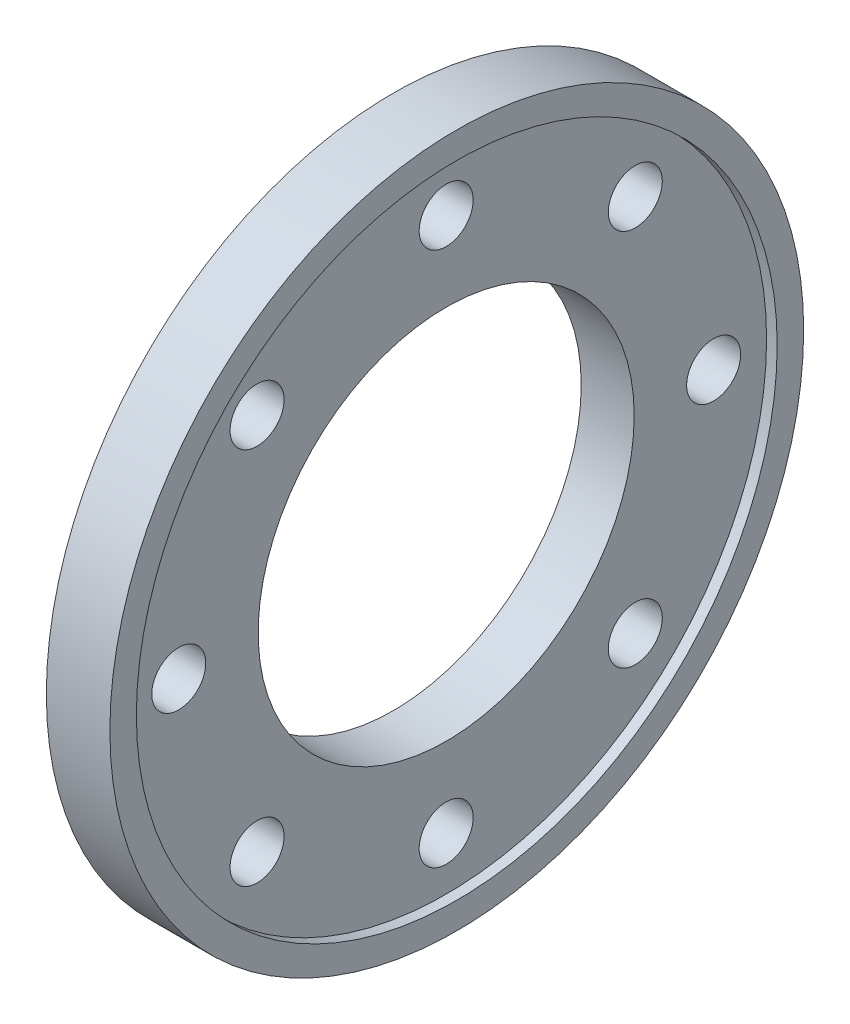
ISO-10303-21;
HEADER;
FILE_DESCRIPTION(('STEP AP214'),'2;1');
FILE_NAME('part.step','',(''),(''),'','','');
FILE_SCHEMA(('AUTOMOTIVE_DESIGN { 1 0 10303 214 1 1 1 1 }'));
ENDSEC;
DATA;
#1=APPLICATION_CONTEXT('core data for automotive mechanical design processes');
#2=APPLICATION_PROTOCOL_DEFINITION('international standard','automotive_design',2000,#1);
#3=PRODUCT_CONTEXT('',#1,'mechanical');
#4=PRODUCT('Part','Part','',(#3));
#5=PRODUCT_RELATED_PRODUCT_CATEGORY('part','',(#4));
#6=PRODUCT_DEFINITION_FORMATION('','',#4);
#7=PRODUCT_DEFINITION_CONTEXT('part definition',#1,'design');
#8=PRODUCT_DEFINITION('design','',#6,#7);
#9=PRODUCT_DEFINITION_SHAPE('','',#8);
#10=(LENGTH_UNIT() NAMED_UNIT(*) SI_UNIT(.MILLI.,.METRE.));
#11=(NAMED_UNIT(*) PLANE_ANGLE_UNIT() SI_UNIT($,.RADIAN.));
#12=(NAMED_UNIT(*) SI_UNIT($,.STERADIAN.) SOLID_ANGLE_UNIT());
#13=UNCERTAINTY_MEASURE_WITH_UNIT(LENGTH_MEASURE(1.E-05),#10,'distance_accuracy_value','');
#14=(GEOMETRIC_REPRESENTATION_CONTEXT(3) GLOBAL_UNCERTAINTY_ASSIGNED_CONTEXT((#13)) GLOBAL_UNIT_ASSIGNED_CONTEXT((#10,
#11,#12)) REPRESENTATION_CONTEXT('',''));
#15=CARTESIAN_POINT('',(0.,0.,0.));
#16=DIRECTION('',(0.,0.,1.));
#17=DIRECTION('',(1.,0.,0.));
#18=AXIS2_PLACEMENT_3D('',#15,#16,#17);
#19=CARTESIAN_POINT('',(6.,0.,0.));
#20=DIRECTION('',(-1.,0.,0.));
#21=DIRECTION('',(0.,0.,1.));
#22=AXIS2_PLACEMENT_3D('',#19,#20,#21);
#23=CYLINDRICAL_SURFACE('',#22,35.5);
#24=CARTESIAN_POINT('',(-6.,0.,0.));
#25=DIRECTION('',(1.,0.,0.));
#26=DIRECTION('',(0.,0.,-1.));
#27=AXIS2_PLACEMENT_3D('',#24,#25,#26);
#28=CIRCLE('',#27,35.5);
#29=CARTESIAN_POINT('',(-6.,0.,-35.5));
#30=VERTEX_POINT('',#29);
#31=EDGE_CURVE('E56',#30,#30,#28,.T.);
#32=ORIENTED_EDGE('',*,*,#31,.F.);
#33=EDGE_LOOP('',(#32));
#34=FACE_BOUND('',#33,.T.);
#35=CARTESIAN_POINT('',(4.,0.,0.));
#36=DIRECTION('',(1.,0.,0.));
#37=DIRECTION('',(0.,0.,-1.));
#38=AXIS2_PLACEMENT_3D('',#35,#36,#37);
#39=CIRCLE('',#38,35.5);
#40=CARTESIAN_POINT('',(4.,0.,-35.5));
#41=VERTEX_POINT('',#40);
#42=EDGE_CURVE('E93',#41,#41,#39,.T.);
#43=ORIENTED_EDGE('',*,*,#42,.T.);
#44=EDGE_LOOP('',(#43));
#45=FACE_BOUND('',#44,.T.);
#46=ADVANCED_FACE('F40',(#34,#45),#23,.F.);
#47=CARTESIAN_POINT('',(6.,50.5,0.));
#48=DIRECTION('',(-1.,0.,0.));
#49=DIRECTION('',(0.,0.,1.));
#50=AXIS2_PLACEMENT_3D('',#47,#48,#49);
#51=CYLINDRICAL_SURFACE('',#50,5.1);
#52=CARTESIAN_POINT('',(-6.,50.5,0.));
#53=DIRECTION('',(1.,0.,0.));
#54=DIRECTION('',(0.,0.,-1.));
#55=AXIS2_PLACEMENT_3D('',#52,#53,#54);
#56=CIRCLE('',#55,5.1);
#57=CARTESIAN_POINT('',(-6.,50.5,-5.1));
#58=VERTEX_POINT('',#57);
#59=EDGE_CURVE('E61',#58,#58,#56,.T.);
#60=ORIENTED_EDGE('',*,*,#59,.F.);
#61=EDGE_LOOP('',(#60));
#62=FACE_BOUND('',#61,.T.);
#63=CARTESIAN_POINT('',(4.,50.5,0.));
#64=DIRECTION('',(1.,0.,0.));
#65=DIRECTION('',(0.,0.,-1.));
#66=AXIS2_PLACEMENT_3D('',#63,#64,#65);
#67=CIRCLE('',#66,5.1);
#68=CARTESIAN_POINT('',(4.,50.5,-5.1));
#69=VERTEX_POINT('',#68);
#70=EDGE_CURVE('E97',#69,#69,#67,.T.);
#71=ORIENTED_EDGE('',*,*,#70,.T.);
#72=EDGE_LOOP('',(#71));
#73=FACE_BOUND('',#72,.T.);
#74=ADVANCED_FACE('F155',(#62,#73),#51,.F.);
#75=CARTESIAN_POINT('',(6.,35.7088924499206,-35.7088924499206));
#76=DIRECTION('',(-1.,0.,0.));
#77=DIRECTION('',(0.,0.,1.));
#78=AXIS2_PLACEMENT_3D('',#75,#76,#77);
#79=CYLINDRICAL_SURFACE('',#78,5.1);
#80=CARTESIAN_POINT('',(-6.,35.7088924499206,-35.7088924499206));
#81=DIRECTION('',(1.,0.,0.));
#82=DIRECTION('',(0.,0.,-1.));
#83=AXIS2_PLACEMENT_3D('',#80,#81,#82);
#84=CIRCLE('',#83,5.1);
#85=CARTESIAN_POINT('',(-6.,35.7088924499206,-40.8088924499206));
#86=VERTEX_POINT('',#85);
#87=EDGE_CURVE('E65',#86,#86,#84,.T.);
#88=ORIENTED_EDGE('',*,*,#87,.F.);
#89=EDGE_LOOP('',(#88));
#90=FACE_BOUND('',#89,.T.);
#91=CARTESIAN_POINT('',(4.,35.7088924499206,-35.7088924499206));
#92=DIRECTION('',(1.,0.,0.));
#93=DIRECTION('',(0.,0.,-1.));
#94=AXIS2_PLACEMENT_3D('',#91,#92,#93);
#95=CIRCLE('',#94,5.1);
#96=CARTESIAN_POINT('',(4.,35.7088924499206,-40.8088924499206));
#97=VERTEX_POINT('',#96);
#98=EDGE_CURVE('E101',#97,#97,#95,.T.);
#99=ORIENTED_EDGE('',*,*,#98,.T.);
#100=EDGE_LOOP('',(#99));
#101=FACE_BOUND('',#100,.T.);
#102=ADVANCED_FACE('F161',(#90,#101),#79,.F.);
#103=CARTESIAN_POINT('',(6.,0.,-50.5));
#104=DIRECTION('',(-1.,0.,0.));
#105=DIRECTION('',(0.,0.,1.));
#106=AXIS2_PLACEMENT_3D('',#103,#104,#105);
#107=CYLINDRICAL_SURFACE('',#106,5.10000000000001);
#108=CARTESIAN_POINT('',(-6.,0.,-50.5));
#109=DIRECTION('',(1.,0.,0.));
#110=DIRECTION('',(0.,0.,-1.));
#111=AXIS2_PLACEMENT_3D('',#108,#109,#110);
#112=CIRCLE('',#111,5.10000000000001);
#113=CARTESIAN_POINT('',(-6.,0.,-55.6));
#114=VERTEX_POINT('',#113);
#115=EDGE_CURVE('E69',#114,#114,#112,.T.);
#116=ORIENTED_EDGE('',*,*,#115,.F.);
#117=EDGE_LOOP('',(#116));
#118=FACE_BOUND('',#117,.T.);
#119=CARTESIAN_POINT('',(4.,0.,-50.5));
#120=DIRECTION('',(1.,0.,0.));
#121=DIRECTION('',(0.,0.,-1.));
#122=AXIS2_PLACEMENT_3D('',#119,#120,#121);
#123=CIRCLE('',#122,5.10000000000001);
#124=CARTESIAN_POINT('',(4.,0.,-55.6));
#125=VERTEX_POINT('',#124);
#126=EDGE_CURVE('E105',#125,#125,#123,.T.);
#127=ORIENTED_EDGE('',*,*,#126,.T.);
#128=EDGE_LOOP('',(#127));
#129=FACE_BOUND('',#128,.T.);
#130=ADVANCED_FACE('F217',(#118,#129),#107,.F.);
#131=CARTESIAN_POINT('',(6.,-35.7088924499206,-35.7088924499206));
#132=DIRECTION('',(-1.,0.,0.));
#133=DIRECTION('',(0.,0.,1.));
#134=AXIS2_PLACEMENT_3D('',#131,#132,#133);
#135=CYLINDRICAL_SURFACE('',#134,5.09999999999999);
#136=CARTESIAN_POINT('',(-6.,-35.7088924499206,-35.7088924499206));
#137=DIRECTION('',(1.,0.,0.));
#138=DIRECTION('',(0.,0.,-1.));
#139=AXIS2_PLACEMENT_3D('',#136,#137,#138);
#140=CIRCLE('',#139,5.09999999999999);
#141=CARTESIAN_POINT('',(-6.,-35.7088924499206,-40.8088924499206));
#142=VERTEX_POINT('',#141);
#143=EDGE_CURVE('E73',#142,#142,#140,.T.);
#144=ORIENTED_EDGE('',*,*,#143,.F.);
#145=EDGE_LOOP('',(#144));
#146=FACE_BOUND('',#145,.T.);
#147=CARTESIAN_POINT('',(4.,-35.7088924499206,-35.7088924499206));
#148=DIRECTION('',(1.,0.,0.));
#149=DIRECTION('',(0.,0.,-1.));
#150=AXIS2_PLACEMENT_3D('',#147,#148,#149);
#151=CIRCLE('',#150,5.09999999999999);
#152=CARTESIAN_POINT('',(4.,-35.7088924499206,-40.8088924499206));
#153=VERTEX_POINT('',#152);
#154=EDGE_CURVE('E109',#153,#153,#151,.T.);
#155=ORIENTED_EDGE('',*,*,#154,.T.);
#156=EDGE_LOOP('',(#155));
#157=FACE_BOUND('',#156,.T.);
#158=ADVANCED_FACE('F213',(#146,#157),#135,.F.);
#159=CARTESIAN_POINT('',(6.,-50.5,0.));
#160=DIRECTION('',(-1.,0.,0.));
#161=DIRECTION('',(0.,0.,1.));
#162=AXIS2_PLACEMENT_3D('',#159,#160,#161);
#163=CYLINDRICAL_SURFACE('',#162,5.1);
#164=CARTESIAN_POINT('',(-6.,-50.5,0.));
#165=DIRECTION('',(1.,0.,0.));
#166=DIRECTION('',(0.,0.,-1.));
#167=AXIS2_PLACEMENT_3D('',#164,#165,#166);
#168=CIRCLE('',#167,5.1);
#169=CARTESIAN_POINT('',(-6.,-50.5,-5.10000000000001));
#170=VERTEX_POINT('',#169);
#171=EDGE_CURVE('E77',#170,#170,#168,.T.);
#172=ORIENTED_EDGE('',*,*,#171,.F.);
#173=EDGE_LOOP('',(#172));
#174=FACE_BOUND('',#173,.T.);
#175=CARTESIAN_POINT('',(4.,-50.5,0.));
#176=DIRECTION('',(1.,0.,0.));
#177=DIRECTION('',(0.,0.,-1.));
#178=AXIS2_PLACEMENT_3D('',#175,#176,#177);
#179=CIRCLE('',#178,5.1);
#180=CARTESIAN_POINT('',(4.,-50.5,-5.10000000000001));
#181=VERTEX_POINT('',#180);
#182=EDGE_CURVE('E113',#181,#181,#179,.T.);
#183=ORIENTED_EDGE('',*,*,#182,.T.);
#184=EDGE_LOOP('',(#183));
#185=FACE_BOUND('',#184,.T.);
#186=ADVANCED_FACE('F209',(#174,#185),#163,.F.);
#187=CARTESIAN_POINT('',(6.,-35.7088924499206,35.7088924499206));
#188=DIRECTION('',(-1.,0.,0.));
#189=DIRECTION('',(0.,0.,1.));
#190=AXIS2_PLACEMENT_3D('',#187,#188,#189);
#191=CYLINDRICAL_SURFACE('',#190,5.1);
#192=CARTESIAN_POINT('',(-6.,-35.7088924499206,35.7088924499206));
#193=DIRECTION('',(1.,0.,0.));
#194=DIRECTION('',(0.,0.,-1.));
#195=AXIS2_PLACEMENT_3D('',#192,#193,#194);
#196=CIRCLE('',#195,5.1);
#197=CARTESIAN_POINT('',(-6.,-35.7088924499206,30.6088924499206));
#198=VERTEX_POINT('',#197);
#199=EDGE_CURVE('E81',#198,#198,#196,.T.);
#200=ORIENTED_EDGE('',*,*,#199,.F.);
#201=EDGE_LOOP('',(#200));
#202=FACE_BOUND('',#201,.T.);
#203=CARTESIAN_POINT('',(4.,-35.7088924499206,35.7088924499206));
#204=DIRECTION('',(1.,0.,0.));
#205=DIRECTION('',(0.,0.,-1.));
#206=AXIS2_PLACEMENT_3D('',#203,#204,#205);
#207=CIRCLE('',#206,5.1);
#208=CARTESIAN_POINT('',(4.,-35.7088924499206,30.6088924499206));
#209=VERTEX_POINT('',#208);
#210=EDGE_CURVE('E117',#209,#209,#207,.T.);
#211=ORIENTED_EDGE('',*,*,#210,.T.);
#212=EDGE_LOOP('',(#211));
#213=FACE_BOUND('',#212,.T.);
#214=ADVANCED_FACE('F203',(#202,#213),#191,.F.);
#215=CARTESIAN_POINT('',(6.,0.,50.5));
#216=DIRECTION('',(-1.,0.,0.));
#217=DIRECTION('',(0.,0.,1.));
#218=AXIS2_PLACEMENT_3D('',#215,#216,#217);
#219=CYLINDRICAL_SURFACE('',#218,5.1);
#220=CARTESIAN_POINT('',(-6.,0.,50.5));
#221=DIRECTION('',(1.,0.,0.));
#222=DIRECTION('',(0.,0.,-1.));
#223=AXIS2_PLACEMENT_3D('',#220,#221,#222);
#224=CIRCLE('',#223,5.1);
#225=CARTESIAN_POINT('',(-6.,0.,45.4));
#226=VERTEX_POINT('',#225);
#227=EDGE_CURVE('E85',#226,#226,#224,.T.);
#228=ORIENTED_EDGE('',*,*,#227,.F.);
#229=EDGE_LOOP('',(#228));
#230=FACE_BOUND('',#229,.T.);
#231=CARTESIAN_POINT('',(4.,0.,50.5));
#232=DIRECTION('',(1.,0.,0.));
#233=DIRECTION('',(0.,0.,-1.));
#234=AXIS2_PLACEMENT_3D('',#231,#232,#233);
#235=CIRCLE('',#234,5.1);
#236=CARTESIAN_POINT('',(4.,0.,45.4));
#237=VERTEX_POINT('',#236);
#238=EDGE_CURVE('E121',#237,#237,#235,.T.);
#239=ORIENTED_EDGE('',*,*,#238,.T.);
#240=EDGE_LOOP('',(#239));
#241=FACE_BOUND('',#240,.T.);
#242=ADVANCED_FACE('F198',(#230,#241),#219,.F.);
#243=CARTESIAN_POINT('',(6.,35.7088924499206,35.7088924499206));
#244=DIRECTION('',(-1.,0.,0.));
#245=DIRECTION('',(0.,0.,1.));
#246=AXIS2_PLACEMENT_3D('',#243,#244,#245);
#247=CYLINDRICAL_SURFACE('',#246,5.1);
#248=CARTESIAN_POINT('',(-6.,35.7088924499206,35.7088924499206));
#249=DIRECTION('',(1.,0.,0.));
#250=DIRECTION('',(0.,0.,-1.));
#251=AXIS2_PLACEMENT_3D('',#248,#249,#250);
#252=CIRCLE('',#251,5.1);
#253=CARTESIAN_POINT('',(-6.,35.7088924499206,30.6088924499206));
#254=VERTEX_POINT('',#253);
#255=EDGE_CURVE('E89',#254,#254,#252,.T.);
#256=ORIENTED_EDGE('',*,*,#255,.F.);
#257=EDGE_LOOP('',(#256));
#258=FACE_BOUND('',#257,.T.);
#259=CARTESIAN_POINT('',(4.,35.7088924499206,35.7088924499206));
#260=DIRECTION('',(1.,0.,0.));
#261=DIRECTION('',(0.,0.,-1.));
#262=AXIS2_PLACEMENT_3D('',#259,#260,#261);
#263=CIRCLE('',#262,5.1);
#264=CARTESIAN_POINT('',(4.,35.7088924499206,30.6088924499206));
#265=VERTEX_POINT('',#264);
#266=EDGE_CURVE('E44',#265,#265,#263,.T.);
#267=ORIENTED_EDGE('',*,*,#266,.T.);
#268=EDGE_LOOP('',(#267));
#269=FACE_BOUND('',#268,.T.);
#270=ADVANCED_FACE('F140',(#258,#269),#247,.F.);
#271=CARTESIAN_POINT('',(6.,0.,0.));
#272=DIRECTION('',(1.,0.,0.));
#273=DIRECTION('',(0.,0.,-1.));
#274=AXIS2_PLACEMENT_3D('',#271,#272,#273);
#275=PLANE('',#274);
#276=CARTESIAN_POINT('',(6.,0.,0.));
#277=DIRECTION('',(1.,0.,0.));
#278=DIRECTION('',(0.,0.,-1.));
#279=AXIS2_PLACEMENT_3D('',#276,#277,#278);
#280=CIRCLE('',#279,60.5);
#281=CARTESIAN_POINT('',(6.,0.,-60.5));
#282=VERTEX_POINT('',#281);
#283=EDGE_CURVE('E125',#282,#282,#280,.T.);
#284=ORIENTED_EDGE('',*,*,#283,.F.);
#285=EDGE_LOOP('',(#284));
#286=FACE_BOUND('',#285,.T.);
#287=CARTESIAN_POINT('',(6.,0.,0.));
#288=DIRECTION('',(1.,0.,0.));
#289=DIRECTION('',(0.,0.,-1.));
#290=AXIS2_PLACEMENT_3D('',#287,#288,#289);
#291=CIRCLE('',#290,65.5);
#292=CARTESIAN_POINT('',(6.,0.,-65.5));
#293=VERTEX_POINT('',#292);
#294=EDGE_CURVE('E11',#293,#293,#291,.T.);
#295=ORIENTED_EDGE('',*,*,#294,.T.);
#296=EDGE_LOOP('',(#295));
#297=FACE_BOUND('',#296,.T.);
#298=ADVANCED_FACE('F168',(#286,#297),#275,.T.);
#299=CARTESIAN_POINT('',(-6.,0.,0.));
#300=DIRECTION('',(1.,0.,0.));
#301=DIRECTION('',(0.,0.,-1.));
#302=AXIS2_PLACEMENT_3D('',#299,#300,#301);
#303=PLANE('',#302);
#304=CARTESIAN_POINT('',(-6.,0.,0.));
#305=DIRECTION('',(1.,0.,0.));
#306=DIRECTION('',(0.,0.,-1.));
#307=AXIS2_PLACEMENT_3D('',#304,#305,#306);
#308=CIRCLE('',#307,65.5);
#309=CARTESIAN_POINT('',(-6.,0.,-65.5));
#310=VERTEX_POINT('',#309);
#311=EDGE_CURVE('E49',#310,#310,#308,.T.);
#312=ORIENTED_EDGE('',*,*,#311,.F.);
#313=EDGE_LOOP('',(#312));
#314=FACE_BOUND('',#313,.T.);
#315=ORIENTED_EDGE('',*,*,#31,.T.);
#316=EDGE_LOOP('',(#315));
#317=FACE_BOUND('',#316,.T.);
#318=ORIENTED_EDGE('',*,*,#59,.T.);
#319=EDGE_LOOP('',(#318));
#320=FACE_BOUND('',#319,.T.);
#321=ORIENTED_EDGE('',*,*,#87,.T.);
#322=EDGE_LOOP('',(#321));
#323=FACE_BOUND('',#322,.T.);
#324=ORIENTED_EDGE('',*,*,#115,.T.);
#325=EDGE_LOOP('',(#324));
#326=FACE_BOUND('',#325,.T.);
#327=ORIENTED_EDGE('',*,*,#143,.T.);
#328=EDGE_LOOP('',(#327));
#329=FACE_BOUND('',#328,.T.);
#330=ORIENTED_EDGE('',*,*,#171,.T.);
#331=EDGE_LOOP('',(#330));
#332=FACE_BOUND('',#331,.T.);
#333=ORIENTED_EDGE('',*,*,#199,.T.);
#334=EDGE_LOOP('',(#333));
#335=FACE_BOUND('',#334,.T.);
#336=ORIENTED_EDGE('',*,*,#227,.T.);
#337=EDGE_LOOP('',(#336));
#338=FACE_BOUND('',#337,.T.);
#339=ORIENTED_EDGE('',*,*,#255,.T.);
#340=EDGE_LOOP('',(#339));
#341=FACE_BOUND('',#340,.T.);
#342=ADVANCED_FACE('F170',(#314,#317,#320,#323,#326,#329,#332,#335,#338,#341),#303,.F.);
#343=CARTESIAN_POINT('',(6.,0.,0.));
#344=DIRECTION('',(-1.,0.,0.));
#345=DIRECTION('',(0.,0.,1.));
#346=AXIS2_PLACEMENT_3D('',#343,#344,#345);
#347=CYLINDRICAL_SURFACE('',#346,65.5);
#348=ORIENTED_EDGE('',*,*,#294,.F.);
#349=EDGE_LOOP('',(#348));
#350=FACE_BOUND('',#349,.T.);
#351=ORIENTED_EDGE('',*,*,#311,.T.);
#352=EDGE_LOOP('',(#351));
#353=FACE_BOUND('',#352,.T.);
#354=ADVANCED_FACE('F42',(#350,#353),#347,.T.);
#355=CARTESIAN_POINT('',(4.,0.,0.));
#356=DIRECTION('',(1.,0.,0.));
#357=DIRECTION('',(0.,0.,-1.));
#358=AXIS2_PLACEMENT_3D('',#355,#356,#357);
#359=CYLINDRICAL_SURFACE('',#358,60.5);
#360=CARTESIAN_POINT('',(4.,0.,0.));
#361=DIRECTION('',(1.,0.,0.));
#362=DIRECTION('',(0.,0.,-1.));
#363=AXIS2_PLACEMENT_3D('',#360,#361,#362);
#364=CIRCLE('',#363,60.5);
#365=CARTESIAN_POINT('',(4.,0.,-60.5));
#366=VERTEX_POINT('',#365);
#367=EDGE_CURVE('E129',#366,#366,#364,.T.);
#368=ORIENTED_EDGE('',*,*,#367,.F.);
#369=EDGE_LOOP('',(#368));
#370=FACE_BOUND('',#369,.T.);
#371=ORIENTED_EDGE('',*,*,#283,.T.);
#372=EDGE_LOOP('',(#371));
#373=FACE_BOUND('',#372,.T.);
#374=ADVANCED_FACE('F144',(#370,#373),#359,.F.);
#375=CARTESIAN_POINT('',(4.,0.,0.));
#376=DIRECTION('',(1.,0.,0.));
#377=DIRECTION('',(0.,0.,-1.));
#378=AXIS2_PLACEMENT_3D('',#375,#376,#377);
#379=PLANE('',#378);
#380=ORIENTED_EDGE('',*,*,#42,.F.);
#381=EDGE_LOOP('',(#380));
#382=FACE_BOUND('',#381,.T.);
#383=ORIENTED_EDGE('',*,*,#70,.F.);
#384=EDGE_LOOP('',(#383));
#385=FACE_BOUND('',#384,.T.);
#386=ORIENTED_EDGE('',*,*,#98,.F.);
#387=EDGE_LOOP('',(#386));
#388=FACE_BOUND('',#387,.T.);
#389=ORIENTED_EDGE('',*,*,#126,.F.);
#390=EDGE_LOOP('',(#389));
#391=FACE_BOUND('',#390,.T.);
#392=ORIENTED_EDGE('',*,*,#154,.F.);
#393=EDGE_LOOP('',(#392));
#394=FACE_BOUND('',#393,.T.);
#395=ORIENTED_EDGE('',*,*,#182,.F.);
#396=EDGE_LOOP('',(#395));
#397=FACE_BOUND('',#396,.T.);
#398=ORIENTED_EDGE('',*,*,#210,.F.);
#399=EDGE_LOOP('',(#398));
#400=FACE_BOUND('',#399,.T.);
#401=ORIENTED_EDGE('',*,*,#238,.F.);
#402=EDGE_LOOP('',(#401));
#403=FACE_BOUND('',#402,.T.);
#404=ORIENTED_EDGE('',*,*,#266,.F.);
#405=EDGE_LOOP('',(#404));
#406=FACE_BOUND('',#405,.T.);
#407=ORIENTED_EDGE('',*,*,#367,.T.);
#408=EDGE_LOOP('',(#407));
#409=FACE_BOUND('',#408,.T.);
#410=ADVANCED_FACE('F142',(#382,#385,#388,#391,#394,#397,#400,#403,#406,#409),#379,.T.);
#411=CLOSED_SHELL('',(#46,#74,#102,#130,#158,#186,#214,#242,#270,#298,#342,#354,#374,#410));
#412=MANIFOLD_SOLID_BREP('B2',#411);
#413=ADVANCED_BREP_SHAPE_REPRESENTATION('',(#18,#412),#14);
#414=SHAPE_DEFINITION_REPRESENTATION(#9,#413);
ENDSEC;
END-ISO-10303-21;
